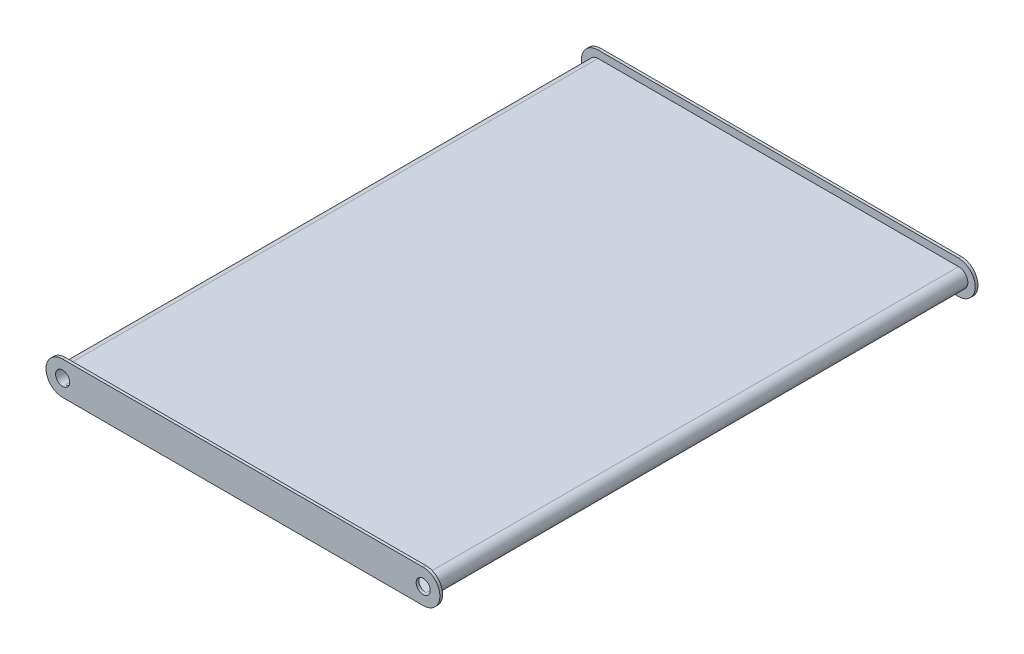
ISO-10303-21;
HEADER;
FILE_DESCRIPTION(('STEP AP214'),'2;1');
FILE_NAME('part.step','',(''),(''),'','','');
FILE_SCHEMA(('AUTOMOTIVE_DESIGN { 1 0 10303 214 1 1 1 1 }'));
ENDSEC;
DATA;
#1=APPLICATION_CONTEXT('core data for automotive mechanical design processes');
#2=APPLICATION_PROTOCOL_DEFINITION('international standard','automotive_design',2000,#1);
#3=PRODUCT_CONTEXT('',#1,'mechanical');
#4=PRODUCT('Part','Part','',(#3));
#5=PRODUCT_RELATED_PRODUCT_CATEGORY('part','',(#4));
#6=PRODUCT_DEFINITION_FORMATION('','',#4);
#7=PRODUCT_DEFINITION_CONTEXT('part definition',#1,'design');
#8=PRODUCT_DEFINITION('design','',#6,#7);
#9=PRODUCT_DEFINITION_SHAPE('','',#8);
#10=(LENGTH_UNIT() NAMED_UNIT(*) SI_UNIT(.MILLI.,.METRE.));
#11=(NAMED_UNIT(*) PLANE_ANGLE_UNIT() SI_UNIT($,.RADIAN.));
#12=(NAMED_UNIT(*) SI_UNIT($,.STERADIAN.) SOLID_ANGLE_UNIT());
#13=UNCERTAINTY_MEASURE_WITH_UNIT(LENGTH_MEASURE(1.E-05),#10,'distance_accuracy_value','');
#14=(GEOMETRIC_REPRESENTATION_CONTEXT(3) GLOBAL_UNCERTAINTY_ASSIGNED_CONTEXT((#13)) GLOBAL_UNIT_ASSIGNED_CONTEXT((#10,
#11,#12)) REPRESENTATION_CONTEXT('',''));
#15=CARTESIAN_POINT('',(0.,0.,0.));
#16=DIRECTION('',(0.,0.,1.));
#17=DIRECTION('',(1.,0.,0.));
#18=AXIS2_PLACEMENT_3D('',#15,#16,#17);
#19=CARTESIAN_POINT('',(-324.9668,0.,960.));
#20=DIRECTION('',(0.,0.,-1.));
#21=DIRECTION('',(-1.,0.,0.));
#22=AXIS2_PLACEMENT_3D('',#19,#20,#21);
#23=CYLINDRICAL_SURFACE('',#22,16.7000000000001);
#24=CARTESIAN_POINT('',(-324.9668,0.,0.));
#25=DIRECTION('',(0.,0.,1.));
#26=DIRECTION('',(1.,0.,0.));
#27=AXIS2_PLACEMENT_3D('',#24,#25,#26);
#28=CIRCLE('',#27,16.7000000000001);
#29=CARTESIAN_POINT('',(-324.9668,16.7000000000001,0.));
#30=VERTEX_POINT('',#29);
#31=CARTESIAN_POINT('',(-324.9668,-16.7000000000001,0.));
#32=VERTEX_POINT('',#31);
#33=EDGE_CURVE('E314',#30,#32,#28,.T.);
#34=ORIENTED_EDGE('',*,*,#33,.T.);
#35=DIRECTION('',(0.,0.,-1.));
#36=VECTOR('',#35,1.);
#37=CARTESIAN_POINT('',(-324.9668,-16.7000000000001,960.));
#38=LINE('',#37,#36);
#39=CARTESIAN_POINT('',(-324.9668,-16.7000000000001,960.));
#40=VERTEX_POINT('',#39);
#41=EDGE_CURVE('E12',#40,#32,#38,.T.);
#42=ORIENTED_EDGE('',*,*,#41,.F.);
#43=CARTESIAN_POINT('',(-324.9668,0.,960.));
#44=DIRECTION('',(0.,0.,1.));
#45=DIRECTION('',(1.,0.,0.));
#46=AXIS2_PLACEMENT_3D('',#43,#44,#45);
#47=CIRCLE('',#46,16.7000000000001);
#48=CARTESIAN_POINT('',(-324.9668,16.7000000000001,960.));
#49=VERTEX_POINT('',#48);
#50=EDGE_CURVE('E315',#49,#40,#47,.T.);
#51=ORIENTED_EDGE('',*,*,#50,.F.);
#52=DIRECTION('',(0.,0.,-1.));
#53=VECTOR('',#52,1.);
#54=CARTESIAN_POINT('',(-324.9668,16.7000000000001,960.));
#55=LINE('',#54,#53);
#56=EDGE_CURVE('E328',#49,#30,#55,.T.);
#57=ORIENTED_EDGE('',*,*,#56,.T.);
#58=EDGE_LOOP('',(#34,#42,#51,#57));
#59=FACE_BOUND('',#58,.T.);
#60=ADVANCED_FACE('F97',(#59),#23,.T.);
#61=CARTESIAN_POINT('',(-324.9668,-16.7000000000001,960.));
#62=DIRECTION('',(0.,1.,0.));
#63=DIRECTION('',(-1.,0.,0.));
#64=AXIS2_PLACEMENT_3D('',#61,#62,#63);
#65=PLANE('',#64);
#66=DIRECTION('',(1.,0.,0.));
#67=VECTOR('',#66,1.);
#68=CARTESIAN_POINT('',(-324.9668,-16.7000000000001,0.));
#69=LINE('',#68,#67);
#70=CARTESIAN_POINT('',(324.9668,-16.6999999999999,0.));
#71=VERTEX_POINT('',#70);
#72=EDGE_CURVE('E331',#32,#71,#69,.T.);
#73=ORIENTED_EDGE('',*,*,#72,.T.);
#74=DIRECTION('',(0.,0.,-1.));
#75=VECTOR('',#74,1.);
#76=CARTESIAN_POINT('',(324.9668,-16.6999999999999,960.));
#77=LINE('',#76,#75);
#78=CARTESIAN_POINT('',(324.9668,-16.6999999999999,960.));
#79=VERTEX_POINT('',#78);
#80=EDGE_CURVE('E105',#79,#71,#77,.T.);
#81=ORIENTED_EDGE('',*,*,#80,.F.);
#82=DIRECTION('',(1.,0.,0.));
#83=VECTOR('',#82,1.);
#84=CARTESIAN_POINT('',(-324.9668,-16.7000000000001,960.));
#85=LINE('',#84,#83);
#86=EDGE_CURVE('E318',#40,#79,#85,.T.);
#87=ORIENTED_EDGE('',*,*,#86,.F.);
#88=ORIENTED_EDGE('',*,*,#41,.T.);
#89=EDGE_LOOP('',(#73,#81,#87,#88));
#90=FACE_BOUND('',#89,.T.);
#91=ADVANCED_FACE('F344',(#90),#65,.F.);
#92=CARTESIAN_POINT('',(324.9668,1.19390865434747E-13,960.));
#93=DIRECTION('',(0.,0.,-1.));
#94=DIRECTION('',(-1.,0.,0.));
#95=AXIS2_PLACEMENT_3D('',#92,#93,#94);
#96=CYLINDRICAL_SURFACE('',#95,16.7);
#97=CARTESIAN_POINT('',(324.9668,1.19390865434747E-13,0.));
#98=DIRECTION('',(0.,0.,1.));
#99=DIRECTION('',(1.,0.,0.));
#100=AXIS2_PLACEMENT_3D('',#97,#98,#99);
#101=CIRCLE('',#100,16.7);
#102=CARTESIAN_POINT('',(324.9668,16.7000000000001,0.));
#103=VERTEX_POINT('',#102);
#104=EDGE_CURVE('E334',#71,#103,#101,.T.);
#105=ORIENTED_EDGE('',*,*,#104,.T.);
#106=DIRECTION('',(0.,0.,-1.));
#107=VECTOR('',#106,1.);
#108=CARTESIAN_POINT('',(324.9668,16.7000000000001,960.));
#109=LINE('',#108,#107);
#110=CARTESIAN_POINT('',(324.9668,16.7000000000001,960.));
#111=VERTEX_POINT('',#110);
#112=EDGE_CURVE('E112',#111,#103,#109,.T.);
#113=ORIENTED_EDGE('',*,*,#112,.F.);
#114=CARTESIAN_POINT('',(324.9668,1.19390865434747E-13,960.));
#115=DIRECTION('',(0.,0.,1.));
#116=DIRECTION('',(1.,0.,0.));
#117=AXIS2_PLACEMENT_3D('',#114,#115,#116);
#118=CIRCLE('',#117,16.7);
#119=EDGE_CURVE('E322',#79,#111,#118,.T.);
#120=ORIENTED_EDGE('',*,*,#119,.F.);
#121=ORIENTED_EDGE('',*,*,#80,.T.);
#122=EDGE_LOOP('',(#105,#113,#120,#121));
#123=FACE_BOUND('',#122,.T.);
#124=ADVANCED_FACE('F341',(#123),#96,.T.);
#125=CARTESIAN_POINT('',(-324.9668,16.7000000000001,960.));
#126=DIRECTION('',(0.,-1.,0.));
#127=DIRECTION('',(0.,0.,-1.));
#128=AXIS2_PLACEMENT_3D('',#125,#126,#127);
#129=PLANE('',#128);
#130=DIRECTION('',(-1.,0.,0.));
#131=VECTOR('',#130,1.);
#132=CARTESIAN_POINT('',(-324.9668,16.7000000000001,0.));
#133=LINE('',#132,#131);
#134=EDGE_CURVE('E319',#103,#30,#133,.T.);
#135=ORIENTED_EDGE('',*,*,#134,.T.);
#136=ORIENTED_EDGE('',*,*,#56,.F.);
#137=DIRECTION('',(-1.,0.,0.));
#138=VECTOR('',#137,1.);
#139=CARTESIAN_POINT('',(-324.9668,16.7000000000001,960.));
#140=LINE('',#139,#138);
#141=EDGE_CURVE('E325',#111,#49,#140,.T.);
#142=ORIENTED_EDGE('',*,*,#141,.F.);
#143=ORIENTED_EDGE('',*,*,#112,.T.);
#144=EDGE_LOOP('',(#135,#136,#142,#143));
#145=FACE_BOUND('',#144,.T.);
#146=ADVANCED_FACE('F351',(#145),#129,.F.);
#147=CARTESIAN_POINT('',(-324.9668,0.,960.));
#148=DIRECTION('',(0.,0.,-1.));
#149=DIRECTION('',(-1.,0.,0.));
#150=AXIS2_PLACEMENT_3D('',#147,#148,#149);
#151=CYLINDRICAL_SURFACE('',#150,12.7000000000001);
#152=DIRECTION('',(0.,0.,-1.));
#153=VECTOR('',#152,1.);
#154=CARTESIAN_POINT('',(-324.9668,-12.7000000000001,960.));
#155=LINE('',#154,#153);
#156=CARTESIAN_POINT('',(-324.9668,-12.7000000000001,960.));
#157=VERTEX_POINT('',#156);
#158=CARTESIAN_POINT('',(-324.9668,-12.7000000000001,0.));
#159=VERTEX_POINT('',#158);
#160=EDGE_CURVE('E311',#157,#159,#155,.T.);
#161=ORIENTED_EDGE('',*,*,#160,.T.);
#162=CARTESIAN_POINT('',(-324.9668,0.,0.));
#163=DIRECTION('',(0.,0.,1.));
#164=DIRECTION('',(1.,0.,0.));
#165=AXIS2_PLACEMENT_3D('',#162,#163,#164);
#166=CIRCLE('',#165,12.7000000000001);
#167=CARTESIAN_POINT('',(-324.9668,12.7000000000001,0.));
#168=VERTEX_POINT('',#167);
#169=EDGE_CURVE('E449',#168,#159,#166,.F.);
#170=ORIENTED_EDGE('',*,*,#169,.F.);
#171=DIRECTION('',(0.,0.,-1.));
#172=VECTOR('',#171,1.);
#173=CARTESIAN_POINT('',(-324.9668,12.7000000000001,960.));
#174=LINE('',#173,#172);
#175=CARTESIAN_POINT('',(-324.9668,12.7000000000001,960.));
#176=VERTEX_POINT('',#175);
#177=EDGE_CURVE('E301',#176,#168,#174,.T.);
#178=ORIENTED_EDGE('',*,*,#177,.F.);
#179=CARTESIAN_POINT('',(-324.9668,0.,960.));
#180=DIRECTION('',(0.,0.,1.));
#181=DIRECTION('',(1.,0.,0.));
#182=AXIS2_PLACEMENT_3D('',#179,#180,#181);
#183=CIRCLE('',#182,12.7000000000001);
#184=EDGE_CURVE('E254',#176,#157,#183,.F.);
#185=ORIENTED_EDGE('',*,*,#184,.T.);
#186=EDGE_LOOP('',(#161,#170,#178,#185));
#187=FACE_BOUND('',#186,.T.);
#188=CARTESIAN_POINT('',(-324.9668,0.,965.));
#189=DIRECTION('',(0.,0.,1.));
#190=DIRECTION('',(1.,0.,0.));
#191=AXIS2_PLACEMENT_3D('',#188,#189,#190);
#192=CIRCLE('',#191,12.7000000000001);
#193=CARTESIAN_POINT('',(-312.2668,0.,965.));
#194=VERTEX_POINT('',#193);
#195=EDGE_CURVE('E257',#194,#194,#192,.F.);
#196=ORIENTED_EDGE('',*,*,#195,.F.);
#197=EDGE_LOOP('',(#196));
#198=FACE_BOUND('',#197,.T.);
#199=CARTESIAN_POINT('',(-324.9668,0.,-5.));
#200=DIRECTION('',(0.,0.,1.));
#201=DIRECTION('',(1.,0.,0.));
#202=AXIS2_PLACEMENT_3D('',#199,#200,#201);
#203=CIRCLE('',#202,12.7000000000001);
#204=CARTESIAN_POINT('',(-312.2668,0.,-5.));
#205=VERTEX_POINT('',#204);
#206=EDGE_CURVE('E240',#205,#205,#203,.F.);
#207=ORIENTED_EDGE('',*,*,#206,.T.);
#208=EDGE_LOOP('',(#207));
#209=FACE_BOUND('',#208,.T.);
#210=ADVANCED_FACE('F389',(#187,#198,#209),#151,.F.);
#211=CARTESIAN_POINT('',(-324.9668,-12.7000000000001,960.));
#212=DIRECTION('',(0.,1.,0.));
#213=DIRECTION('',(-1.,0.,0.));
#214=AXIS2_PLACEMENT_3D('',#211,#212,#213);
#215=PLANE('',#214);
#216=DIRECTION('',(1.,0.,0.));
#217=VECTOR('',#216,1.);
#218=CARTESIAN_POINT('',(-324.9668,-12.7000000000001,0.));
#219=LINE('',#218,#217);
#220=CARTESIAN_POINT('',(324.9668,-12.7,0.));
#221=VERTEX_POINT('',#220);
#222=EDGE_CURVE('E293',#159,#221,#219,.T.);
#223=ORIENTED_EDGE('',*,*,#222,.F.);
#224=ORIENTED_EDGE('',*,*,#160,.F.);
#225=DIRECTION('',(1.,0.,0.));
#226=VECTOR('',#225,1.);
#227=CARTESIAN_POINT('',(-324.9668,-12.7000000000001,960.));
#228=LINE('',#227,#226);
#229=CARTESIAN_POINT('',(324.9668,-12.7,960.));
#230=VERTEX_POINT('',#229);
#231=EDGE_CURVE('E294',#157,#230,#228,.T.);
#232=ORIENTED_EDGE('',*,*,#231,.T.);
#233=DIRECTION('',(0.,0.,-1.));
#234=VECTOR('',#233,1.);
#235=CARTESIAN_POINT('',(324.9668,-12.7,960.));
#236=LINE('',#235,#234);
#237=EDGE_CURVE('E309',#230,#221,#236,.T.);
#238=ORIENTED_EDGE('',*,*,#237,.T.);
#239=EDGE_LOOP('',(#223,#224,#232,#238));
#240=FACE_BOUND('',#239,.T.);
#241=ADVANCED_FACE('F392',(#240),#215,.T.);
#242=CARTESIAN_POINT('',(324.9668,1.19390865434747E-13,960.));
#243=DIRECTION('',(0.,0.,-1.));
#244=DIRECTION('',(-1.,0.,0.));
#245=AXIS2_PLACEMENT_3D('',#242,#243,#244);
#246=CYLINDRICAL_SURFACE('',#245,12.7000000000001);
#247=DIRECTION('',(0.,0.,-1.));
#248=VECTOR('',#247,1.);
#249=CARTESIAN_POINT('',(324.9668,12.7000000000002,960.));
#250=LINE('',#249,#248);
#251=CARTESIAN_POINT('',(324.9668,12.7000000000002,960.));
#252=VERTEX_POINT('',#251);
#253=CARTESIAN_POINT('',(324.9668,12.7000000000002,0.));
#254=VERTEX_POINT('',#253);
#255=EDGE_CURVE('E307',#252,#254,#250,.T.);
#256=ORIENTED_EDGE('',*,*,#255,.T.);
#257=CARTESIAN_POINT('',(324.9668,1.19390865434747E-13,0.));
#258=DIRECTION('',(0.,0.,1.));
#259=DIRECTION('',(1.,0.,0.));
#260=AXIS2_PLACEMENT_3D('',#257,#258,#259);
#261=CIRCLE('',#260,12.7000000000001);
#262=EDGE_CURVE('E454',#221,#254,#261,.F.);
#263=ORIENTED_EDGE('',*,*,#262,.F.);
#264=ORIENTED_EDGE('',*,*,#237,.F.);
#265=CARTESIAN_POINT('',(324.9668,1.19390865434747E-13,960.));
#266=DIRECTION('',(0.,0.,1.));
#267=DIRECTION('',(1.,0.,0.));
#268=AXIS2_PLACEMENT_3D('',#265,#266,#267);
#269=CIRCLE('',#268,12.7000000000001);
#270=EDGE_CURVE('E217',#230,#252,#269,.F.);
#271=ORIENTED_EDGE('',*,*,#270,.T.);
#272=EDGE_LOOP('',(#256,#263,#264,#271));
#273=FACE_BOUND('',#272,.T.);
#274=CARTESIAN_POINT('',(324.9668,1.19390865434747E-13,965.));
#275=DIRECTION('',(0.,0.,1.));
#276=DIRECTION('',(1.,0.,0.));
#277=AXIS2_PLACEMENT_3D('',#274,#275,#276);
#278=CIRCLE('',#277,12.7000000000001);
#279=CARTESIAN_POINT('',(337.6668,1.19390865434747E-13,965.));
#280=VERTEX_POINT('',#279);
#281=EDGE_CURVE('E251',#280,#280,#278,.F.);
#282=ORIENTED_EDGE('',*,*,#281,.F.);
#283=EDGE_LOOP('',(#282));
#284=FACE_BOUND('',#283,.T.);
#285=CARTESIAN_POINT('',(324.9668,1.19390865434747E-13,-5.));
#286=DIRECTION('',(0.,0.,1.));
#287=DIRECTION('',(1.,0.,0.));
#288=AXIS2_PLACEMENT_3D('',#285,#286,#287);
#289=CIRCLE('',#288,12.7000000000001);
#290=CARTESIAN_POINT('',(337.6668,1.19390865434747E-13,-5.));
#291=VERTEX_POINT('',#290);
#292=EDGE_CURVE('E452',#291,#291,#289,.F.);
#293=ORIENTED_EDGE('',*,*,#292,.T.);
#294=EDGE_LOOP('',(#293));
#295=FACE_BOUND('',#294,.T.);
#296=ADVANCED_FACE('F368',(#273,#284,#295),#246,.F.);
#297=CARTESIAN_POINT('',(-324.9668,12.7000000000001,960.));
#298=DIRECTION('',(0.,-1.,0.));
#299=DIRECTION('',(1.,0.,0.));
#300=AXIS2_PLACEMENT_3D('',#297,#298,#299);
#301=PLANE('',#300);
#302=DIRECTION('',(-1.,0.,0.));
#303=VECTOR('',#302,1.);
#304=CARTESIAN_POINT('',(-324.9668,12.7000000000001,0.));
#305=LINE('',#304,#303);
#306=EDGE_CURVE('E298',#254,#168,#305,.T.);
#307=ORIENTED_EDGE('',*,*,#306,.F.);
#308=ORIENTED_EDGE('',*,*,#255,.F.);
#309=DIRECTION('',(-1.,0.,0.));
#310=VECTOR('',#309,1.);
#311=CARTESIAN_POINT('',(-324.9668,12.7000000000001,960.));
#312=LINE('',#311,#310);
#313=EDGE_CURVE('E297',#252,#176,#312,.T.);
#314=ORIENTED_EDGE('',*,*,#313,.T.);
#315=ORIENTED_EDGE('',*,*,#177,.T.);
#316=EDGE_LOOP('',(#307,#308,#314,#315));
#317=FACE_BOUND('',#316,.T.);
#318=ADVANCED_FACE('F357',(#317),#301,.T.);
#319=CARTESIAN_POINT('',(324.9668,1.19390865434747E-13,960.));
#320=DIRECTION('',(0.,0.,1.));
#321=DIRECTION('',(1.,0.,0.));
#322=AXIS2_PLACEMENT_3D('',#319,#320,#321);
#323=PLANE('',#322);
#324=DIRECTION('',(1.,0.,0.));
#325=VECTOR('',#324,1.);
#326=CARTESIAN_POINT('',(-324.9668,-30.,960.));
#327=LINE('',#326,#325);
#328=CARTESIAN_POINT('',(-324.9668,-30.,960.));
#329=VERTEX_POINT('',#328);
#330=CARTESIAN_POINT('',(324.9668,-29.9999999999999,960.));
#331=VERTEX_POINT('',#330);
#332=EDGE_CURVE('E260',#329,#331,#327,.T.);
#333=ORIENTED_EDGE('',*,*,#332,.F.);
#334=CARTESIAN_POINT('',(-324.9668,0.,960.));
#335=DIRECTION('',(0.,0.,1.));
#336=DIRECTION('',(1.,0.,0.));
#337=AXIS2_PLACEMENT_3D('',#334,#335,#336);
#338=CIRCLE('',#337,30.);
#339=CARTESIAN_POINT('',(-324.9668,30.,960.));
#340=VERTEX_POINT('',#339);
#341=EDGE_CURVE('E267',#340,#329,#338,.T.);
#342=ORIENTED_EDGE('',*,*,#341,.F.);
#343=DIRECTION('',(1.,0.,0.));
#344=VECTOR('',#343,1.);
#345=CARTESIAN_POINT('',(-324.9668,30.,960.));
#346=LINE('',#345,#344);
#347=CARTESIAN_POINT('',(324.9668,30.0000000000001,960.));
#348=VERTEX_POINT('',#347);
#349=EDGE_CURVE('E280',#340,#348,#346,.T.);
#350=ORIENTED_EDGE('',*,*,#349,.T.);
#351=CARTESIAN_POINT('',(324.9668,1.19390865434747E-13,960.));
#352=DIRECTION('',(0.,0.,1.));
#353=DIRECTION('',(1.,0.,0.));
#354=AXIS2_PLACEMENT_3D('',#351,#352,#353);
#355=CIRCLE('',#354,30.);
#356=EDGE_CURVE('E277',#331,#348,#355,.T.);
#357=ORIENTED_EDGE('',*,*,#356,.F.);
#358=EDGE_LOOP('',(#333,#342,#350,#357));
#359=FACE_BOUND('',#358,.T.);
#360=ORIENTED_EDGE('',*,*,#141,.T.);
#361=ORIENTED_EDGE('',*,*,#50,.T.);
#362=ORIENTED_EDGE('',*,*,#86,.T.);
#363=ORIENTED_EDGE('',*,*,#119,.T.);
#364=EDGE_LOOP('',(#360,#361,#362,#363));
#365=FACE_BOUND('',#364,.T.);
#366=ADVANCED_FACE('F354',(#359,#365),#323,.F.);
#367=CARTESIAN_POINT('',(-324.9668,-30.,965.));
#368=DIRECTION('',(0.,1.,0.));
#369=DIRECTION('',(0.,0.,1.));
#370=AXIS2_PLACEMENT_3D('',#367,#368,#369);
#371=PLANE('',#370);
#372=ORIENTED_EDGE('',*,*,#332,.T.);
#373=DIRECTION('',(0.,0.,-1.));
#374=VECTOR('',#373,1.);
#375=CARTESIAN_POINT('',(324.9668,-29.9999999999999,965.));
#376=LINE('',#375,#374);
#377=CARTESIAN_POINT('',(324.9668,-29.9999999999999,965.));
#378=VERTEX_POINT('',#377);
#379=EDGE_CURVE('E290',#378,#331,#376,.T.);
#380=ORIENTED_EDGE('',*,*,#379,.F.);
#381=DIRECTION('',(1.,0.,0.));
#382=VECTOR('',#381,1.);
#383=CARTESIAN_POINT('',(-324.9668,-30.,965.));
#384=LINE('',#383,#382);
#385=CARTESIAN_POINT('',(-324.9668,-30.,965.));
#386=VERTEX_POINT('',#385);
#387=EDGE_CURVE('E263',#386,#378,#384,.T.);
#388=ORIENTED_EDGE('',*,*,#387,.F.);
#389=DIRECTION('',(0.,0.,-1.));
#390=VECTOR('',#389,1.);
#391=CARTESIAN_POINT('',(-324.9668,-30.,965.));
#392=LINE('',#391,#390);
#393=EDGE_CURVE('E274',#386,#329,#392,.T.);
#394=ORIENTED_EDGE('',*,*,#393,.T.);
#395=EDGE_LOOP('',(#372,#380,#388,#394));
#396=FACE_BOUND('',#395,.T.);
#397=ADVANCED_FACE('F356',(#396),#371,.F.);
#398=CARTESIAN_POINT('',(324.9668,1.19390865434747E-13,965.));
#399=DIRECTION('',(0.,0.,-1.));
#400=DIRECTION('',(-1.,0.,0.));
#401=AXIS2_PLACEMENT_3D('',#398,#399,#400);
#402=CYLINDRICAL_SURFACE('',#401,30.);
#403=ORIENTED_EDGE('',*,*,#356,.T.);
#404=DIRECTION('',(0.,0.,-1.));
#405=VECTOR('',#404,1.);
#406=CARTESIAN_POINT('',(324.9668,30.0000000000001,965.));
#407=LINE('',#406,#405);
#408=CARTESIAN_POINT('',(324.9668,30.0000000000001,965.));
#409=VERTEX_POINT('',#408);
#410=EDGE_CURVE('E288',#409,#348,#407,.T.);
#411=ORIENTED_EDGE('',*,*,#410,.F.);
#412=CARTESIAN_POINT('',(324.9668,1.19390865434747E-13,965.));
#413=DIRECTION('',(0.,0.,1.));
#414=DIRECTION('',(1.,0.,0.));
#415=AXIS2_PLACEMENT_3D('',#412,#413,#414);
#416=CIRCLE('',#415,30.);
#417=EDGE_CURVE('E266',#378,#409,#416,.T.);
#418=ORIENTED_EDGE('',*,*,#417,.F.);
#419=ORIENTED_EDGE('',*,*,#379,.T.);
#420=EDGE_LOOP('',(#403,#411,#418,#419));
#421=FACE_BOUND('',#420,.T.);
#422=ADVANCED_FACE('F365',(#421),#402,.T.);
#423=CARTESIAN_POINT('',(-324.9668,30.,965.));
#424=DIRECTION('',(0.,1.,0.));
#425=DIRECTION('',(0.,0.,1.));
#426=AXIS2_PLACEMENT_3D('',#423,#424,#425);
#427=PLANE('',#426);
#428=ORIENTED_EDGE('',*,*,#349,.F.);
#429=DIRECTION('',(0.,0.,-1.));
#430=VECTOR('',#429,1.);
#431=CARTESIAN_POINT('',(-324.9668,30.,965.));
#432=LINE('',#431,#430);
#433=CARTESIAN_POINT('',(-324.9668,30.,965.));
#434=VERTEX_POINT('',#433);
#435=EDGE_CURVE('E286',#434,#340,#432,.T.);
#436=ORIENTED_EDGE('',*,*,#435,.F.);
#437=DIRECTION('',(1.,0.,0.));
#438=VECTOR('',#437,1.);
#439=CARTESIAN_POINT('',(-324.9668,30.,965.));
#440=LINE('',#439,#438);
#441=EDGE_CURVE('E269',#434,#409,#440,.T.);
#442=ORIENTED_EDGE('',*,*,#441,.T.);
#443=ORIENTED_EDGE('',*,*,#410,.T.);
#444=EDGE_LOOP('',(#428,#436,#442,#443));
#445=FACE_BOUND('',#444,.T.);
#446=ADVANCED_FACE('F402',(#445),#427,.T.);
#447=CARTESIAN_POINT('',(-324.9668,0.,965.));
#448=DIRECTION('',(0.,0.,-1.));
#449=DIRECTION('',(-1.,0.,0.));
#450=AXIS2_PLACEMENT_3D('',#447,#448,#449);
#451=CYLINDRICAL_SURFACE('',#450,30.);
#452=ORIENTED_EDGE('',*,*,#341,.T.);
#453=ORIENTED_EDGE('',*,*,#393,.F.);
#454=CARTESIAN_POINT('',(-324.9668,0.,965.));
#455=DIRECTION('',(0.,0.,1.));
#456=DIRECTION('',(1.,0.,0.));
#457=AXIS2_PLACEMENT_3D('',#454,#455,#456);
#458=CIRCLE('',#457,30.);
#459=EDGE_CURVE('E272',#434,#386,#458,.T.);
#460=ORIENTED_EDGE('',*,*,#459,.F.);
#461=ORIENTED_EDGE('',*,*,#435,.T.);
#462=EDGE_LOOP('',(#452,#453,#460,#461));
#463=FACE_BOUND('',#462,.T.);
#464=ADVANCED_FACE('F405',(#463),#451,.T.);
#465=CARTESIAN_POINT('',(324.9668,1.19390865434747E-13,965.));
#466=DIRECTION('',(0.,0.,1.));
#467=DIRECTION('',(1.,0.,0.));
#468=AXIS2_PLACEMENT_3D('',#465,#466,#467);
#469=PLANE('',#468);
#470=ORIENTED_EDGE('',*,*,#281,.T.);
#471=EDGE_LOOP('',(#470));
#472=FACE_BOUND('',#471,.T.);
#473=ORIENTED_EDGE('',*,*,#195,.T.);
#474=EDGE_LOOP('',(#473));
#475=FACE_BOUND('',#474,.T.);
#476=ORIENTED_EDGE('',*,*,#387,.T.);
#477=ORIENTED_EDGE('',*,*,#417,.T.);
#478=ORIENTED_EDGE('',*,*,#441,.F.);
#479=ORIENTED_EDGE('',*,*,#459,.T.);
#480=EDGE_LOOP('',(#476,#477,#478,#479));
#481=FACE_BOUND('',#480,.T.);
#482=ADVANCED_FACE('F376',(#472,#475,#481),#469,.T.);
#483=ORIENTED_EDGE('',*,*,#231,.F.);
#484=ORIENTED_EDGE('',*,*,#184,.F.);
#485=ORIENTED_EDGE('',*,*,#313,.F.);
#486=ORIENTED_EDGE('',*,*,#270,.F.);
#487=EDGE_LOOP('',(#483,#484,#485,#486));
#488=FACE_BOUND('',#487,.T.);
#489=ADVANCED_FACE('F360',(#488),#323,.F.);
#490=CARTESIAN_POINT('',(324.9668,1.19390865434747E-13,0.));
#491=DIRECTION('',(0.,0.,-1.));
#492=DIRECTION('',(1.,0.,0.));
#493=AXIS2_PLACEMENT_3D('',#490,#491,#492);
#494=PLANE('',#493);
#495=ORIENTED_EDGE('',*,*,#169,.T.);
#496=ORIENTED_EDGE('',*,*,#222,.T.);
#497=ORIENTED_EDGE('',*,*,#262,.T.);
#498=ORIENTED_EDGE('',*,*,#306,.T.);
#499=EDGE_LOOP('',(#495,#496,#497,#498));
#500=FACE_BOUND('',#499,.T.);
#501=ADVANCED_FACE('F375',(#500),#494,.F.);
#502=CARTESIAN_POINT('',(324.9668,1.19390865434747E-13,-5.));
#503=DIRECTION('',(0.,0.,-1.));
#504=DIRECTION('',(1.,0.,0.));
#505=AXIS2_PLACEMENT_3D('',#502,#503,#504);
#506=PLANE('',#505);
#507=ORIENTED_EDGE('',*,*,#206,.F.);
#508=EDGE_LOOP('',(#507));
#509=FACE_BOUND('',#508,.T.);
#510=DIRECTION('',(1.,0.,0.));
#511=VECTOR('',#510,1.);
#512=CARTESIAN_POINT('',(-324.9668,-30.,-5.));
#513=LINE('',#512,#511);
#514=CARTESIAN_POINT('',(-324.9668,-30.,-5.));
#515=VERTEX_POINT('',#514);
#516=CARTESIAN_POINT('',(324.9668,-29.9999999999999,-5.));
#517=VERTEX_POINT('',#516);
#518=EDGE_CURVE('E209',#515,#517,#513,.T.);
#519=ORIENTED_EDGE('',*,*,#518,.F.);
#520=CARTESIAN_POINT('',(-324.9668,0.,-5.));
#521=DIRECTION('',(0.,0.,1.));
#522=DIRECTION('',(1.,0.,0.));
#523=AXIS2_PLACEMENT_3D('',#520,#521,#522);
#524=CIRCLE('',#523,30.);
#525=CARTESIAN_POINT('',(-324.9668,30.,-5.));
#526=VERTEX_POINT('',#525);
#527=EDGE_CURVE('E224',#526,#515,#524,.T.);
#528=ORIENTED_EDGE('',*,*,#527,.F.);
#529=DIRECTION('',(1.,0.,0.));
#530=VECTOR('',#529,1.);
#531=CARTESIAN_POINT('',(-324.9668,30.,-5.));
#532=LINE('',#531,#530);
#533=CARTESIAN_POINT('',(324.9668,30.0000000000001,-5.));
#534=VERTEX_POINT('',#533);
#535=EDGE_CURVE('E231',#526,#534,#532,.T.);
#536=ORIENTED_EDGE('',*,*,#535,.T.);
#537=CARTESIAN_POINT('',(324.9668,1.19390865434747E-13,-5.));
#538=DIRECTION('',(0.,0.,1.));
#539=DIRECTION('',(1.,0.,0.));
#540=AXIS2_PLACEMENT_3D('',#537,#538,#539);
#541=CIRCLE('',#540,30.);
#542=EDGE_CURVE('E226',#517,#534,#541,.T.);
#543=ORIENTED_EDGE('',*,*,#542,.F.);
#544=EDGE_LOOP('',(#519,#528,#536,#543));
#545=FACE_BOUND('',#544,.T.);
#546=ORIENTED_EDGE('',*,*,#292,.F.);
#547=EDGE_LOOP('',(#546));
#548=FACE_BOUND('',#547,.T.);
#549=ADVANCED_FACE('F222',(#509,#545,#548),#506,.T.);
#550=ORIENTED_EDGE('',*,*,#33,.F.);
#551=ORIENTED_EDGE('',*,*,#134,.F.);
#552=ORIENTED_EDGE('',*,*,#104,.F.);
#553=ORIENTED_EDGE('',*,*,#72,.F.);
#554=EDGE_LOOP('',(#550,#551,#552,#553));
#555=FACE_BOUND('',#554,.T.);
#556=DIRECTION('',(1.,0.,0.));
#557=VECTOR('',#556,1.);
#558=CARTESIAN_POINT('',(-324.9668,-30.,0.));
#559=LINE('',#558,#557);
#560=CARTESIAN_POINT('',(-324.9668,-30.,0.));
#561=VERTEX_POINT('',#560);
#562=CARTESIAN_POINT('',(324.9668,-29.9999999999999,0.));
#563=VERTEX_POINT('',#562);
#564=EDGE_CURVE('E212',#561,#563,#559,.T.);
#565=ORIENTED_EDGE('',*,*,#564,.T.);
#566=CARTESIAN_POINT('',(324.9668,1.19390865434747E-13,0.));
#567=DIRECTION('',(0.,0.,1.));
#568=DIRECTION('',(1.,0.,0.));
#569=AXIS2_PLACEMENT_3D('',#566,#567,#568);
#570=CIRCLE('',#569,30.);
#571=CARTESIAN_POINT('',(324.9668,30.0000000000001,0.));
#572=VERTEX_POINT('',#571);
#573=EDGE_CURVE('E227',#563,#572,#570,.T.);
#574=ORIENTED_EDGE('',*,*,#573,.T.);
#575=DIRECTION('',(1.,0.,0.));
#576=VECTOR('',#575,1.);
#577=CARTESIAN_POINT('',(-324.9668,30.,0.));
#578=LINE('',#577,#576);
#579=CARTESIAN_POINT('',(-324.9668,30.,0.));
#580=VERTEX_POINT('',#579);
#581=EDGE_CURVE('E242',#580,#572,#578,.T.);
#582=ORIENTED_EDGE('',*,*,#581,.F.);
#583=CARTESIAN_POINT('',(-324.9668,0.,0.));
#584=DIRECTION('',(0.,0.,1.));
#585=DIRECTION('',(1.,0.,0.));
#586=AXIS2_PLACEMENT_3D('',#583,#584,#585);
#587=CIRCLE('',#586,30.);
#588=EDGE_CURVE('E239',#580,#561,#587,.T.);
#589=ORIENTED_EDGE('',*,*,#588,.T.);
#590=EDGE_LOOP('',(#565,#574,#582,#589));
#591=FACE_BOUND('',#590,.T.);
#592=ADVANCED_FACE('F347',(#555,#591),#494,.F.);
#593=CARTESIAN_POINT('',(-324.9668,-30.,-5.));
#594=DIRECTION('',(0.,-1.,0.));
#595=DIRECTION('',(0.,0.,-1.));
#596=AXIS2_PLACEMENT_3D('',#593,#594,#595);
#597=PLANE('',#596);
#598=ORIENTED_EDGE('',*,*,#564,.F.);
#599=DIRECTION('',(0.,0.,1.));
#600=VECTOR('',#599,1.);
#601=CARTESIAN_POINT('',(-324.9668,-30.,-5.));
#602=LINE('',#601,#600);
#603=EDGE_CURVE('E206',#515,#561,#602,.T.);
#604=ORIENTED_EDGE('',*,*,#603,.F.);
#605=ORIENTED_EDGE('',*,*,#518,.T.);
#606=DIRECTION('',(0.,0.,1.));
#607=VECTOR('',#606,1.);
#608=CARTESIAN_POINT('',(324.9668,-29.9999999999999,-5.));
#609=LINE('',#608,#607);
#610=EDGE_CURVE('E237',#517,#563,#609,.T.);
#611=ORIENTED_EDGE('',*,*,#610,.T.);
#612=EDGE_LOOP('',(#598,#604,#605,#611));
#613=FACE_BOUND('',#612,.T.);
#614=ADVANCED_FACE('F208',(#613),#597,.T.);
#615=CARTESIAN_POINT('',(-324.9668,0.,-5.));
#616=DIRECTION('',(0.,0.,1.));
#617=DIRECTION('',(1.,0.,0.));
#618=AXIS2_PLACEMENT_3D('',#615,#616,#617);
#619=CYLINDRICAL_SURFACE('',#618,30.);
#620=ORIENTED_EDGE('',*,*,#588,.F.);
#621=DIRECTION('',(0.,0.,1.));
#622=VECTOR('',#621,1.);
#623=CARTESIAN_POINT('',(-324.9668,30.,-5.));
#624=LINE('',#623,#622);
#625=EDGE_CURVE('E218',#526,#580,#624,.T.);
#626=ORIENTED_EDGE('',*,*,#625,.F.);
#627=ORIENTED_EDGE('',*,*,#527,.T.);
#628=ORIENTED_EDGE('',*,*,#603,.T.);
#629=EDGE_LOOP('',(#620,#626,#627,#628));
#630=FACE_BOUND('',#629,.T.);
#631=ADVANCED_FACE('F229',(#630),#619,.T.);
#632=CARTESIAN_POINT('',(-324.9668,30.,-5.));
#633=DIRECTION('',(0.,-1.,0.));
#634=DIRECTION('',(0.,0.,-1.));
#635=AXIS2_PLACEMENT_3D('',#632,#633,#634);
#636=PLANE('',#635);
#637=ORIENTED_EDGE('',*,*,#581,.T.);
#638=DIRECTION('',(0.,0.,1.));
#639=VECTOR('',#638,1.);
#640=CARTESIAN_POINT('',(324.9668,30.0000000000001,-5.));
#641=LINE('',#640,#639);
#642=EDGE_CURVE('E248',#534,#572,#641,.T.);
#643=ORIENTED_EDGE('',*,*,#642,.F.);
#644=ORIENTED_EDGE('',*,*,#535,.F.);
#645=ORIENTED_EDGE('',*,*,#625,.T.);
#646=EDGE_LOOP('',(#637,#643,#644,#645));
#647=FACE_BOUND('',#646,.T.);
#648=ADVANCED_FACE('F430',(#647),#636,.F.);
#649=CARTESIAN_POINT('',(324.9668,1.19390865434747E-13,-5.));
#650=DIRECTION('',(0.,0.,1.));
#651=DIRECTION('',(1.,0.,0.));
#652=AXIS2_PLACEMENT_3D('',#649,#650,#651);
#653=CYLINDRICAL_SURFACE('',#652,30.);
#654=ORIENTED_EDGE('',*,*,#573,.F.);
#655=ORIENTED_EDGE('',*,*,#610,.F.);
#656=ORIENTED_EDGE('',*,*,#542,.T.);
#657=ORIENTED_EDGE('',*,*,#642,.T.);
#658=EDGE_LOOP('',(#654,#655,#656,#657));
#659=FACE_BOUND('',#658,.T.);
#660=ADVANCED_FACE('F433',(#659),#653,.T.);
#661=CLOSED_SHELL('',(#60,#91,#124,#146,#210,#241,#296,#318,#366,#397,#422,#446,#464,#482,#489,
#501,#549,#592,#614,#631,#648,#660));
#662=MANIFOLD_SOLID_BREP('B2',#661);
#663=ADVANCED_BREP_SHAPE_REPRESENTATION('',(#18,#662),#14);
#664=SHAPE_DEFINITION_REPRESENTATION(#9,#663);
ENDSEC;
END-ISO-10303-21;
